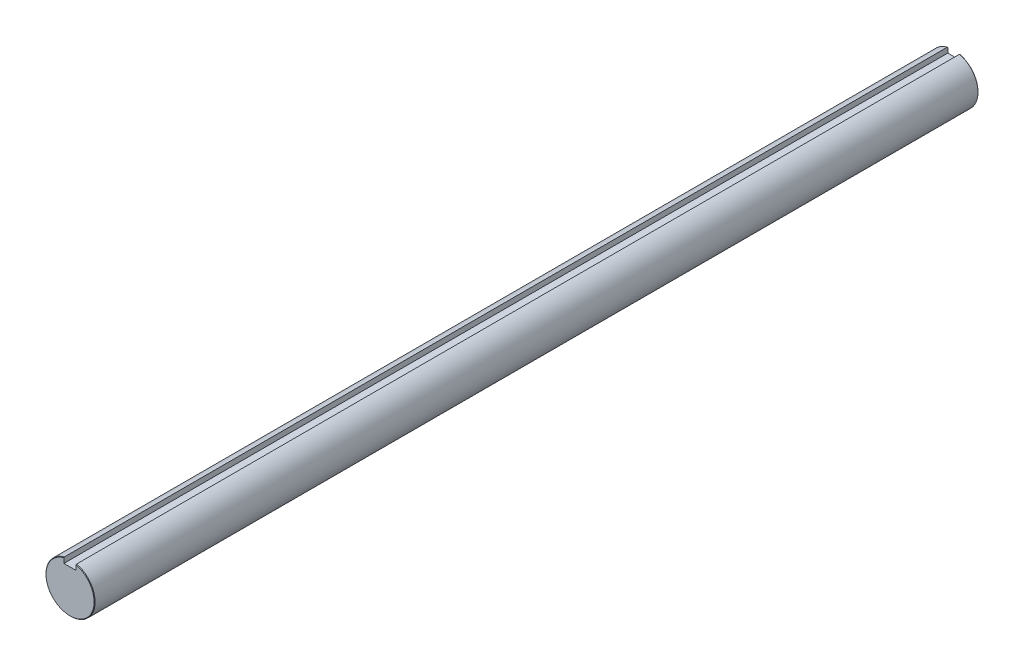
ISO-10303-21;
HEADER;
FILE_DESCRIPTION(('STEP AP214'),'2;1');
FILE_NAME('part.step','',(''),(''),'','','');
FILE_SCHEMA(('AUTOMOTIVE_DESIGN { 1 0 10303 214 1 1 1 1 }'));
ENDSEC;
DATA;
#1=APPLICATION_CONTEXT('core data for automotive mechanical design processes');
#2=APPLICATION_PROTOCOL_DEFINITION('international standard','automotive_design',2000,#1);
#3=PRODUCT_CONTEXT('',#1,'mechanical');
#4=PRODUCT('Part','Part','',(#3));
#5=PRODUCT_RELATED_PRODUCT_CATEGORY('part','',(#4));
#6=PRODUCT_DEFINITION_FORMATION('','',#4);
#7=PRODUCT_DEFINITION_CONTEXT('part definition',#1,'design');
#8=PRODUCT_DEFINITION('design','',#6,#7);
#9=PRODUCT_DEFINITION_SHAPE('','',#8);
#10=(LENGTH_UNIT() NAMED_UNIT(*) SI_UNIT(.MILLI.,.METRE.));
#11=(NAMED_UNIT(*) PLANE_ANGLE_UNIT() SI_UNIT($,.RADIAN.));
#12=(NAMED_UNIT(*) SI_UNIT($,.STERADIAN.) SOLID_ANGLE_UNIT());
#13=UNCERTAINTY_MEASURE_WITH_UNIT(LENGTH_MEASURE(1.E-05),#10,'distance_accuracy_value','');
#14=(GEOMETRIC_REPRESENTATION_CONTEXT(3) GLOBAL_UNCERTAINTY_ASSIGNED_CONTEXT((#13)) GLOBAL_UNIT_ASSIGNED_CONTEXT((#10,
#11,#12)) REPRESENTATION_CONTEXT('',''));
#15=CARTESIAN_POINT('',(0.,0.,0.));
#16=DIRECTION('',(0.,0.,1.));
#17=DIRECTION('',(1.,0.,0.));
#18=AXIS2_PLACEMENT_3D('',#15,#16,#17);
#19=CARTESIAN_POINT('',(0.,0.,114.3));
#20=DIRECTION('',(0.,0.,-1.));
#21=DIRECTION('',(-1.,0.,0.));
#22=AXIS2_PLACEMENT_3D('',#19,#20,#21);
#23=CYLINDRICAL_SURFACE('',#22,6.34999999999999);
#24=DIRECTION('',(0.,0.,-1.));
#25=VECTOR('',#24,1.);
#26=CARTESIAN_POINT('',(-1.5875,6.14836106210426,114.3));
#27=LINE('',#26,#25);
#28=CARTESIAN_POINT('',(-1.5875,6.14836106210426,114.173));
#29=VERTEX_POINT('',#28);
#30=CARTESIAN_POINT('',(-1.5875,6.14836106210426,-114.173));
#31=VERTEX_POINT('',#30);
#32=EDGE_CURVE('E125',#29,#31,#27,.T.);
#33=ORIENTED_EDGE('',*,*,#32,.T.);
#34=CARTESIAN_POINT('',(0.,0.,-114.173));
#35=DIRECTION('',(0.,0.,1.));
#36=DIRECTION('',(1.,0.,0.));
#37=AXIS2_PLACEMENT_3D('',#34,#35,#36);
#38=CIRCLE('',#37,6.34999999999999);
#39=CARTESIAN_POINT('',(1.5875,6.14836106210426,-114.173));
#40=VERTEX_POINT('',#39);
#41=EDGE_CURVE('E132',#31,#40,#38,.T.);
#42=ORIENTED_EDGE('',*,*,#41,.T.);
#43=DIRECTION('',(0.,0.,-1.));
#44=VECTOR('',#43,1.);
#45=CARTESIAN_POINT('',(1.5875,6.14836106210426,114.3));
#46=LINE('',#45,#44);
#47=CARTESIAN_POINT('',(1.5875,6.14836106210426,114.173));
#48=VERTEX_POINT('',#47);
#49=EDGE_CURVE('E112',#48,#40,#46,.T.);
#50=ORIENTED_EDGE('',*,*,#49,.F.);
#51=CARTESIAN_POINT('',(0.,0.,114.173));
#52=DIRECTION('',(0.,0.,1.));
#53=DIRECTION('',(1.,0.,0.));
#54=AXIS2_PLACEMENT_3D('',#51,#52,#53);
#55=CIRCLE('',#54,6.34999999999999);
#56=EDGE_CURVE('E130',#48,#29,#55,.F.);
#57=ORIENTED_EDGE('',*,*,#56,.T.);
#58=EDGE_LOOP('',(#33,#42,#50,#57));
#59=FACE_BOUND('',#58,.T.);
#60=ADVANCED_FACE('F39',(#59),#23,.T.);
#61=CARTESIAN_POINT('',(1.5875,4.74979999999999,114.3));
#62=DIRECTION('',(1.,0.,0.));
#63=DIRECTION('',(0.,0.,-1.));
#64=AXIS2_PLACEMENT_3D('',#61,#62,#63);
#65=PLANE('',#64);
#66=ORIENTED_EDGE('',*,*,#49,.T.);
#67=CARTESIAN_POINT('',(1.5875,6.14836106210426,-114.173));
#68=CARTESIAN_POINT('',(1.5875,6.12649260936833,-114.194174188756));
#69=CARTESIAN_POINT('',(1.5875,6.10462051749243,-114.215344616464));
#70=CARTESIAN_POINT('',(1.5875,6.06086905544761,-114.257677949798));
#71=CARTESIAN_POINT('',(1.5875,6.0389896852787,-114.278840855423));
#72=CARTESIAN_POINT('',(1.5875,6.01710667596981,-114.3));
#73=B_SPLINE_CURVE_WITH_KNOTS('',3,(#67,#68,#69,#70,#71,#72),.UNSPECIFIED.,.F.,.F.,(4,2,4),(0.,
0.0913191037592901,0.182638207573115),.UNSPECIFIED.);
#74=CARTESIAN_POINT('',(1.5875,6.01710667596981,-114.3));
#75=VERTEX_POINT('',#74);
#76=EDGE_CURVE('E103',#40,#75,#73,.T.);
#77=ORIENTED_EDGE('',*,*,#76,.T.);
#78=DIRECTION('',(0.,-1.,0.));
#79=VECTOR('',#78,1.);
#80=CARTESIAN_POINT('',(1.5875,4.74979999999999,-114.3));
#81=LINE('',#80,#79);
#82=CARTESIAN_POINT('',(1.5875,4.74979999999999,-114.3));
#83=VERTEX_POINT('',#82);
#84=EDGE_CURVE('E96',#75,#83,#81,.T.);
#85=ORIENTED_EDGE('',*,*,#84,.T.);
#86=DIRECTION('',(0.,0.,-1.));
#87=VECTOR('',#86,1.);
#88=CARTESIAN_POINT('',(1.5875,4.74979999999999,114.3));
#89=LINE('',#88,#87);
#90=CARTESIAN_POINT('',(1.5875,4.74979999999999,114.3));
#91=VERTEX_POINT('',#90);
#92=EDGE_CURVE('E101',#91,#83,#89,.T.);
#93=ORIENTED_EDGE('',*,*,#92,.F.);
#94=DIRECTION('',(0.,-1.,0.));
#95=VECTOR('',#94,1.);
#96=CARTESIAN_POINT('',(1.5875,4.74979999999999,114.3));
#97=LINE('',#96,#95);
#98=CARTESIAN_POINT('',(1.5875,6.01710667596975,114.3));
#99=VERTEX_POINT('',#98);
#100=EDGE_CURVE('E118',#99,#91,#97,.T.);
#101=ORIENTED_EDGE('',*,*,#100,.F.);
#102=CARTESIAN_POINT('',(1.5875,6.01710667596975,114.3));
#103=CARTESIAN_POINT('',(1.5875,6.03898968527865,114.278840855423));
#104=CARTESIAN_POINT('',(1.5875,6.06086905544757,114.257677949798));
#105=CARTESIAN_POINT('',(1.5875,6.10462051749241,114.215344616464));
#106=CARTESIAN_POINT('',(1.5875,6.12649260936832,114.194174188756));
#107=CARTESIAN_POINT('',(1.5875,6.14836106210426,114.173));
#108=B_SPLINE_CURVE_WITH_KNOTS('',3,(#102,#103,#104,#105,#106,#107),.UNSPECIFIED.,.F.,.F.,(4,2,
4),(0.,0.0913191038138633,0.182638207573191),.UNSPECIFIED.);
#109=EDGE_CURVE('E135',#99,#48,#108,.T.);
#110=ORIENTED_EDGE('',*,*,#109,.T.);
#111=EDGE_LOOP('',(#66,#77,#85,#93,#101,#110));
#112=FACE_BOUND('',#111,.T.);
#113=ADVANCED_FACE('F99',(#112),#65,.F.);
#114=CARTESIAN_POINT('',(1.5875,4.74979999999999,114.3));
#115=DIRECTION('',(0.,-1.,0.));
#116=DIRECTION('',(0.,0.,-1.));
#117=AXIS2_PLACEMENT_3D('',#114,#115,#116);
#118=PLANE('',#117);
#119=ORIENTED_EDGE('',*,*,#92,.T.);
#120=DIRECTION('',(-1.,0.,0.));
#121=VECTOR('',#120,1.);
#122=CARTESIAN_POINT('',(1.5875,4.74979999999999,-114.3));
#123=LINE('',#122,#121);
#124=CARTESIAN_POINT('',(-1.5875,4.74979999999999,-114.3));
#125=VERTEX_POINT('',#124);
#126=EDGE_CURVE('E105',#83,#125,#123,.T.);
#127=ORIENTED_EDGE('',*,*,#126,.T.);
#128=DIRECTION('',(0.,0.,-1.));
#129=VECTOR('',#128,1.);
#130=CARTESIAN_POINT('',(-1.5875,4.74979999999999,114.3));
#131=LINE('',#130,#129);
#132=CARTESIAN_POINT('',(-1.5875,4.74979999999999,114.3));
#133=VERTEX_POINT('',#132);
#134=EDGE_CURVE('E113',#133,#125,#131,.T.);
#135=ORIENTED_EDGE('',*,*,#134,.F.);
#136=DIRECTION('',(-1.,0.,0.));
#137=VECTOR('',#136,1.);
#138=CARTESIAN_POINT('',(1.5875,4.74979999999999,114.3));
#139=LINE('',#138,#137);
#140=EDGE_CURVE('E111',#91,#133,#139,.T.);
#141=ORIENTED_EDGE('',*,*,#140,.F.);
#142=EDGE_LOOP('',(#119,#127,#135,#141));
#143=FACE_BOUND('',#142,.T.);
#144=ADVANCED_FACE('F109',(#143),#118,.F.);
#145=CARTESIAN_POINT('',(-1.5875,4.74979999999999,114.3));
#146=DIRECTION('',(-1.,0.,0.));
#147=DIRECTION('',(0.,0.,1.));
#148=AXIS2_PLACEMENT_3D('',#145,#146,#147);
#149=PLANE('',#148);
#150=DIRECTION('',(0.,1.,0.));
#151=VECTOR('',#150,1.);
#152=CARTESIAN_POINT('',(-1.5875,4.74979999999999,-114.3));
#153=LINE('',#152,#151);
#154=CARTESIAN_POINT('',(-1.5875,6.01710667596981,-114.3));
#155=VERTEX_POINT('',#154);
#156=EDGE_CURVE('E116',#125,#155,#153,.T.);
#157=ORIENTED_EDGE('',*,*,#156,.T.);
#158=CARTESIAN_POINT('',(-1.5875,6.01710667596981,-114.3));
#159=CARTESIAN_POINT('',(-1.5875,6.0389896852787,-114.278840855423));
#160=CARTESIAN_POINT('',(-1.5875,6.06086905544761,-114.257677949798));
#161=CARTESIAN_POINT('',(-1.5875,6.10462051749243,-114.215344616464));
#162=CARTESIAN_POINT('',(-1.5875,6.12649260936833,-114.194174188756));
#163=CARTESIAN_POINT('',(-1.5875,6.14836106210426,-114.173));
#164=B_SPLINE_CURVE_WITH_KNOTS('',3,(#158,#159,#160,#161,#162,#163),.UNSPECIFIED.,.F.,.F.,(4,2,
4),(0.,0.0913191038138228,0.18263820757311),.UNSPECIFIED.);
#165=EDGE_CURVE('E48',#155,#31,#164,.T.);
#166=ORIENTED_EDGE('',*,*,#165,.T.);
#167=ORIENTED_EDGE('',*,*,#32,.F.);
#168=CARTESIAN_POINT('',(-1.5875,6.14836106210426,114.173));
#169=CARTESIAN_POINT('',(-1.5875,6.12649260936832,114.194174188756));
#170=CARTESIAN_POINT('',(-1.5875,6.10462051749241,114.215344616464));
#171=CARTESIAN_POINT('',(-1.5875,6.06086905544758,114.257677949798));
#172=CARTESIAN_POINT('',(-1.5875,6.03898968527865,114.278840855423));
#173=CARTESIAN_POINT('',(-1.5875,6.01710667596975,114.3));
#174=B_SPLINE_CURVE_WITH_KNOTS('',3,(#168,#169,#170,#171,#172,#173),.UNSPECIFIED.,.F.,.F.,(4,2,
4),(0.,0.0913191037593294,0.182638207573194),.UNSPECIFIED.);
#175=CARTESIAN_POINT('',(-1.5875,6.01710667596975,114.3));
#176=VERTEX_POINT('',#175);
#177=EDGE_CURVE('E55',#29,#176,#174,.T.);
#178=ORIENTED_EDGE('',*,*,#177,.T.);
#179=DIRECTION('',(0.,1.,0.));
#180=VECTOR('',#179,1.);
#181=CARTESIAN_POINT('',(-1.5875,4.74979999999999,114.3));
#182=LINE('',#181,#180);
#183=EDGE_CURVE('E123',#133,#176,#182,.T.);
#184=ORIENTED_EDGE('',*,*,#183,.F.);
#185=ORIENTED_EDGE('',*,*,#134,.T.);
#186=EDGE_LOOP('',(#157,#166,#167,#178,#184,#185));
#187=FACE_BOUND('',#186,.T.);
#188=ADVANCED_FACE('F169',(#187),#149,.F.);
#189=CARTESIAN_POINT('',(0.,0.,114.3));
#190=DIRECTION('',(0.,0.,1.));
#191=DIRECTION('',(1.,0.,0.));
#192=AXIS2_PLACEMENT_3D('',#189,#190,#191);
#193=PLANE('',#192);
#194=ORIENTED_EDGE('',*,*,#183,.T.);
#195=CARTESIAN_POINT('',(0.,0.,114.3));
#196=DIRECTION('',(0.,0.,1.));
#197=DIRECTION('',(1.,0.,0.));
#198=AXIS2_PLACEMENT_3D('',#195,#196,#197);
#199=CIRCLE('',#198,6.22299999999998);
#200=EDGE_CURVE('E11',#176,#99,#199,.T.);
#201=ORIENTED_EDGE('',*,*,#200,.T.);
#202=ORIENTED_EDGE('',*,*,#100,.T.);
#203=ORIENTED_EDGE('',*,*,#140,.T.);
#204=EDGE_LOOP('',(#194,#201,#202,#203));
#205=FACE_BOUND('',#204,.T.);
#206=ADVANCED_FACE('F173',(#205),#193,.T.);
#207=CARTESIAN_POINT('',(0.,0.,-114.3));
#208=DIRECTION('',(0.,0.,1.));
#209=DIRECTION('',(1.,0.,0.));
#210=AXIS2_PLACEMENT_3D('',#207,#208,#209);
#211=PLANE('',#210);
#212=ORIENTED_EDGE('',*,*,#84,.F.);
#213=CARTESIAN_POINT('',(0.,0.,-114.3));
#214=DIRECTION('',(0.,0.,1.));
#215=DIRECTION('',(1.,0.,0.));
#216=AXIS2_PLACEMENT_3D('',#213,#214,#215);
#217=CIRCLE('',#216,6.22300000000003);
#218=EDGE_CURVE('E63',#75,#155,#217,.F.);
#219=ORIENTED_EDGE('',*,*,#218,.T.);
#220=ORIENTED_EDGE('',*,*,#156,.F.);
#221=ORIENTED_EDGE('',*,*,#126,.F.);
#222=EDGE_LOOP('',(#212,#219,#220,#221));
#223=FACE_BOUND('',#222,.T.);
#224=ADVANCED_FACE('F115',(#223),#211,.F.);
#225=CARTESIAN_POINT('',(0.,0.,-114.173));
#226=DIRECTION('',(0.,0.,1.));
#227=DIRECTION('',(1.,0.,0.));
#228=AXIS2_PLACEMENT_3D('',#225,#226,#227);
#229=CONICAL_SURFACE('',#228,6.34999999999999,0.785398163397418);
#230=ORIENTED_EDGE('',*,*,#165,.F.);
#231=ORIENTED_EDGE('',*,*,#218,.F.);
#232=ORIENTED_EDGE('',*,*,#76,.F.);
#233=ORIENTED_EDGE('',*,*,#41,.F.);
#234=EDGE_LOOP('',(#230,#231,#232,#233));
#235=FACE_BOUND('',#234,.T.);
#236=ADVANCED_FACE('F155',(#235),#229,.T.);
#237=CARTESIAN_POINT('',(0.,0.,114.3));
#238=DIRECTION('',(0.,0.,-1.));
#239=DIRECTION('',(-1.,0.,0.));
#240=AXIS2_PLACEMENT_3D('',#237,#238,#239);
#241=CONICAL_SURFACE('',#240,6.22299999999998,0.785398163397418);
#242=ORIENTED_EDGE('',*,*,#177,.F.);
#243=ORIENTED_EDGE('',*,*,#56,.F.);
#244=ORIENTED_EDGE('',*,*,#109,.F.);
#245=ORIENTED_EDGE('',*,*,#200,.F.);
#246=EDGE_LOOP('',(#242,#243,#244,#245));
#247=FACE_BOUND('',#246,.T.);
#248=ADVANCED_FACE('F41',(#247),#241,.T.);
#249=CLOSED_SHELL('',(#60,#113,#144,#188,#206,#224,#236,#248));
#250=MANIFOLD_SOLID_BREP('B2',#249);
#251=ADVANCED_BREP_SHAPE_REPRESENTATION('',(#18,#250),#14);
#252=SHAPE_DEFINITION_REPRESENTATION(#9,#251);
ENDSEC;
END-ISO-10303-21;
